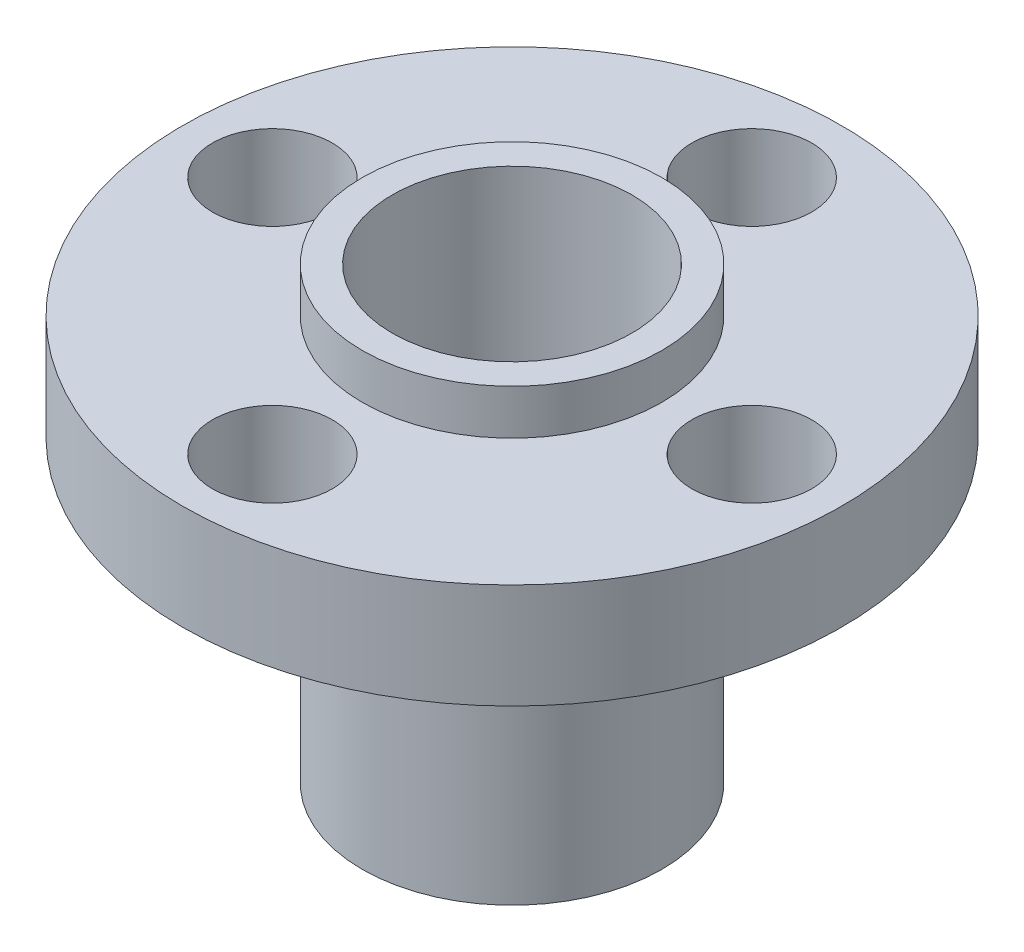
ISO-10303-21;
HEADER;
FILE_DESCRIPTION(('STEP AP214'),'2;1');
FILE_NAME('part.step','',(''),(''),'','','');
FILE_SCHEMA(('AUTOMOTIVE_DESIGN { 1 0 10303 214 1 1 1 1 }'));
ENDSEC;
DATA;
#1=APPLICATION_CONTEXT('core data for automotive mechanical design processes');
#2=APPLICATION_PROTOCOL_DEFINITION('international standard','automotive_design',2000,#1);
#3=PRODUCT_CONTEXT('',#1,'mechanical');
#4=PRODUCT('Part','Part','',(#3));
#5=PRODUCT_RELATED_PRODUCT_CATEGORY('part','',(#4));
#6=PRODUCT_DEFINITION_FORMATION('','',#4);
#7=PRODUCT_DEFINITION_CONTEXT('part definition',#1,'design');
#8=PRODUCT_DEFINITION('design','',#6,#7);
#9=PRODUCT_DEFINITION_SHAPE('','',#8);
#10=(LENGTH_UNIT() NAMED_UNIT(*) SI_UNIT(.MILLI.,.METRE.));
#11=(NAMED_UNIT(*) PLANE_ANGLE_UNIT() SI_UNIT($,.RADIAN.));
#12=(NAMED_UNIT(*) SI_UNIT($,.STERADIAN.) SOLID_ANGLE_UNIT());
#13=UNCERTAINTY_MEASURE_WITH_UNIT(LENGTH_MEASURE(1.E-05),#10,'distance_accuracy_value','');
#14=(GEOMETRIC_REPRESENTATION_CONTEXT(3) GLOBAL_UNCERTAINTY_ASSIGNED_CONTEXT((#13)) GLOBAL_UNIT_ASSIGNED_CONTEXT((#10,
#11,#12)) REPRESENTATION_CONTEXT('',''));
#15=CARTESIAN_POINT('',(0.,0.,0.));
#16=DIRECTION('',(0.,0.,1.));
#17=DIRECTION('',(1.,0.,0.));
#18=AXIS2_PLACEMENT_3D('',#15,#16,#17);
#19=CARTESIAN_POINT('',(0.,3.5,-8.));
#20=DIRECTION('',(0.,-1.,0.));
#21=DIRECTION('',(0.,0.,-1.));
#22=AXIS2_PLACEMENT_3D('',#19,#20,#21);
#23=CYLINDRICAL_SURFACE('',#22,2.);
#24=CARTESIAN_POINT('',(0.,3.5,-8.));
#25=DIRECTION('',(0.,1.,0.));
#26=DIRECTION('',(0.,0.,1.));
#27=AXIS2_PLACEMENT_3D('',#24,#25,#26);
#28=CIRCLE('',#27,2.);
#29=CARTESIAN_POINT('',(0.,3.5,-6.));
#30=VERTEX_POINT('',#29);
#31=EDGE_CURVE('E45',#30,#30,#28,.T.);
#32=ORIENTED_EDGE('',*,*,#31,.T.);
#33=EDGE_LOOP('',(#32));
#34=FACE_BOUND('',#33,.T.);
#35=CARTESIAN_POINT('',(0.,0.,-8.));
#36=DIRECTION('',(0.,1.,0.));
#37=DIRECTION('',(0.,0.,1.));
#38=AXIS2_PLACEMENT_3D('',#35,#36,#37);
#39=CIRCLE('',#38,2.);
#40=CARTESIAN_POINT('',(0.,0.,-6.));
#41=VERTEX_POINT('',#40);
#42=EDGE_CURVE('E58',#41,#41,#39,.T.);
#43=ORIENTED_EDGE('',*,*,#42,.F.);
#44=EDGE_LOOP('',(#43));
#45=FACE_BOUND('',#44,.T.);
#46=ADVANCED_FACE('F32',(#34,#45),#23,.F.);
#47=CARTESIAN_POINT('',(8.,3.5,0.));
#48=DIRECTION('',(0.,-1.,0.));
#49=DIRECTION('',(0.,0.,-1.));
#50=AXIS2_PLACEMENT_3D('',#47,#48,#49);
#51=CYLINDRICAL_SURFACE('',#50,2.);
#52=CARTESIAN_POINT('',(8.,3.5,0.));
#53=DIRECTION('',(0.,1.,0.));
#54=DIRECTION('',(0.,0.,1.));
#55=AXIS2_PLACEMENT_3D('',#52,#53,#54);
#56=CIRCLE('',#55,2.);
#57=CARTESIAN_POINT('',(8.,3.5,2.));
#58=VERTEX_POINT('',#57);
#59=EDGE_CURVE('E72',#58,#58,#56,.T.);
#60=ORIENTED_EDGE('',*,*,#59,.T.);
#61=EDGE_LOOP('',(#60));
#62=FACE_BOUND('',#61,.T.);
#63=CARTESIAN_POINT('',(8.,0.,0.));
#64=DIRECTION('',(0.,1.,0.));
#65=DIRECTION('',(0.,0.,1.));
#66=AXIS2_PLACEMENT_3D('',#63,#64,#65);
#67=CIRCLE('',#66,2.);
#68=CARTESIAN_POINT('',(8.,0.,2.));
#69=VERTEX_POINT('',#68);
#70=EDGE_CURVE('E56',#69,#69,#67,.T.);
#71=ORIENTED_EDGE('',*,*,#70,.F.);
#72=EDGE_LOOP('',(#71));
#73=FACE_BOUND('',#72,.T.);
#74=ADVANCED_FACE('F127',(#62,#73),#51,.F.);
#75=CARTESIAN_POINT('',(0.,3.5,8.));
#76=DIRECTION('',(0.,-1.,0.));
#77=DIRECTION('',(0.,0.,-1.));
#78=AXIS2_PLACEMENT_3D('',#75,#76,#77);
#79=CYLINDRICAL_SURFACE('',#78,2.);
#80=CARTESIAN_POINT('',(0.,3.5,8.));
#81=DIRECTION('',(0.,1.,0.));
#82=DIRECTION('',(0.,0.,1.));
#83=AXIS2_PLACEMENT_3D('',#80,#81,#82);
#84=CIRCLE('',#83,2.);
#85=CARTESIAN_POINT('',(0.,3.5,10.));
#86=VERTEX_POINT('',#85);
#87=EDGE_CURVE('E67',#86,#86,#84,.T.);
#88=ORIENTED_EDGE('',*,*,#87,.T.);
#89=EDGE_LOOP('',(#88));
#90=FACE_BOUND('',#89,.T.);
#91=CARTESIAN_POINT('',(0.,0.,8.));
#92=DIRECTION('',(0.,1.,0.));
#93=DIRECTION('',(0.,0.,1.));
#94=AXIS2_PLACEMENT_3D('',#91,#92,#93);
#95=CIRCLE('',#94,2.);
#96=CARTESIAN_POINT('',(0.,0.,10.));
#97=VERTEX_POINT('',#96);
#98=EDGE_CURVE('E52',#97,#97,#95,.T.);
#99=ORIENTED_EDGE('',*,*,#98,.F.);
#100=EDGE_LOOP('',(#99));
#101=FACE_BOUND('',#100,.T.);
#102=ADVANCED_FACE('F132',(#90,#101),#79,.F.);
#103=CARTESIAN_POINT('',(-8.,3.5,0.));
#104=DIRECTION('',(0.,-1.,0.));
#105=DIRECTION('',(0.,0.,-1.));
#106=AXIS2_PLACEMENT_3D('',#103,#104,#105);
#107=CYLINDRICAL_SURFACE('',#106,2.);
#108=CARTESIAN_POINT('',(-8.,3.5,0.));
#109=DIRECTION('',(0.,1.,0.));
#110=DIRECTION('',(0.,0.,1.));
#111=AXIS2_PLACEMENT_3D('',#108,#109,#110);
#112=CIRCLE('',#111,2.);
#113=CARTESIAN_POINT('',(-8.,3.5,2.));
#114=VERTEX_POINT('',#113);
#115=EDGE_CURVE('E63',#114,#114,#112,.T.);
#116=ORIENTED_EDGE('',*,*,#115,.T.);
#117=EDGE_LOOP('',(#116));
#118=FACE_BOUND('',#117,.T.);
#119=CARTESIAN_POINT('',(-8.,0.,0.));
#120=DIRECTION('',(0.,1.,0.));
#121=DIRECTION('',(0.,0.,1.));
#122=AXIS2_PLACEMENT_3D('',#119,#120,#121);
#123=CIRCLE('',#122,2.);
#124=CARTESIAN_POINT('',(-8.,0.,2.));
#125=VERTEX_POINT('',#124);
#126=EDGE_CURVE('E49',#125,#125,#123,.T.);
#127=ORIENTED_EDGE('',*,*,#126,.F.);
#128=EDGE_LOOP('',(#127));
#129=FACE_BOUND('',#128,.T.);
#130=ADVANCED_FACE('F34',(#118,#129),#107,.F.);
#131=CARTESIAN_POINT('',(0.,3.5,0.));
#132=DIRECTION('',(0.,-1.,0.));
#133=DIRECTION('',(0.,0.,-1.));
#134=AXIS2_PLACEMENT_3D('',#131,#132,#133);
#135=CYLINDRICAL_SURFACE('',#134,11.);
#136=CARTESIAN_POINT('',(0.,3.5,0.));
#137=DIRECTION('',(0.,1.,0.));
#138=DIRECTION('',(0.,0.,1.));
#139=AXIS2_PLACEMENT_3D('',#136,#137,#138);
#140=CIRCLE('',#139,11.);
#141=CARTESIAN_POINT('',(0.,3.5,11.));
#142=VERTEX_POINT('',#141);
#143=EDGE_CURVE('E10',#142,#142,#140,.T.);
#144=ORIENTED_EDGE('',*,*,#143,.F.);
#145=EDGE_LOOP('',(#144));
#146=FACE_BOUND('',#145,.T.);
#147=CARTESIAN_POINT('',(0.,0.,0.));
#148=DIRECTION('',(0.,1.,0.));
#149=DIRECTION('',(0.,0.,1.));
#150=AXIS2_PLACEMENT_3D('',#147,#148,#149);
#151=CIRCLE('',#150,11.);
#152=CARTESIAN_POINT('',(0.,0.,11.));
#153=VERTEX_POINT('',#152);
#154=EDGE_CURVE('E36',#153,#153,#151,.T.);
#155=ORIENTED_EDGE('',*,*,#154,.T.);
#156=EDGE_LOOP('',(#155));
#157=FACE_BOUND('',#156,.T.);
#158=ADVANCED_FACE('F87',(#146,#157),#135,.T.);
#159=CARTESIAN_POINT('',(0.,3.5,0.));
#160=DIRECTION('',(0.,1.,0.));
#161=DIRECTION('',(0.,0.,1.));
#162=AXIS2_PLACEMENT_3D('',#159,#160,#161);
#163=PLANE('',#162);
#164=ORIENTED_EDGE('',*,*,#115,.F.);
#165=EDGE_LOOP('',(#164));
#166=FACE_BOUND('',#165,.T.);
#167=ORIENTED_EDGE('',*,*,#87,.F.);
#168=EDGE_LOOP('',(#167));
#169=FACE_BOUND('',#168,.T.);
#170=ORIENTED_EDGE('',*,*,#59,.F.);
#171=EDGE_LOOP('',(#170));
#172=FACE_BOUND('',#171,.T.);
#173=ORIENTED_EDGE('',*,*,#31,.F.);
#174=EDGE_LOOP('',(#173));
#175=FACE_BOUND('',#174,.T.);
#176=CARTESIAN_POINT('',(0.,3.5,0.));
#177=DIRECTION('',(0.,1.,0.));
#178=DIRECTION('',(0.,0.,1.));
#179=AXIS2_PLACEMENT_3D('',#176,#177,#178);
#180=CIRCLE('',#179,5.);
#181=CARTESIAN_POINT('',(0.,3.5,5.));
#182=VERTEX_POINT('',#181);
#183=EDGE_CURVE('E40',#182,#182,#180,.T.);
#184=ORIENTED_EDGE('',*,*,#183,.F.);
#185=EDGE_LOOP('',(#184));
#186=FACE_BOUND('',#185,.T.);
#187=ORIENTED_EDGE('',*,*,#143,.T.);
#188=EDGE_LOOP('',(#187));
#189=FACE_BOUND('',#188,.T.);
#190=ADVANCED_FACE('F83',(#166,#169,#172,#175,#186,#189),#163,.T.);
#191=CARTESIAN_POINT('',(0.,0.,0.));
#192=DIRECTION('',(0.,1.,0.));
#193=DIRECTION('',(0.,0.,1.));
#194=AXIS2_PLACEMENT_3D('',#191,#192,#193);
#195=PLANE('',#194);
#196=CARTESIAN_POINT('',(0.,0.,0.));
#197=DIRECTION('',(0.,1.,0.));
#198=DIRECTION('',(0.,0.,1.));
#199=AXIS2_PLACEMENT_3D('',#196,#197,#198);
#200=CIRCLE('',#199,5.);
#201=CARTESIAN_POINT('',(0.,0.,5.));
#202=VERTEX_POINT('',#201);
#203=EDGE_CURVE('E110',#202,#202,#200,.T.);
#204=ORIENTED_EDGE('',*,*,#203,.T.);
#205=EDGE_LOOP('',(#204));
#206=FACE_BOUND('',#205,.T.);
#207=ORIENTED_EDGE('',*,*,#126,.T.);
#208=EDGE_LOOP('',(#207));
#209=FACE_BOUND('',#208,.T.);
#210=ORIENTED_EDGE('',*,*,#98,.T.);
#211=EDGE_LOOP('',(#210));
#212=FACE_BOUND('',#211,.T.);
#213=ORIENTED_EDGE('',*,*,#70,.T.);
#214=EDGE_LOOP('',(#213));
#215=FACE_BOUND('',#214,.T.);
#216=ORIENTED_EDGE('',*,*,#42,.T.);
#217=EDGE_LOOP('',(#216));
#218=FACE_BOUND('',#217,.T.);
#219=ORIENTED_EDGE('',*,*,#154,.F.);
#220=EDGE_LOOP('',(#219));
#221=FACE_BOUND('',#220,.T.);
#222=ADVANCED_FACE('F86',(#206,#209,#212,#215,#218,#221),#195,.F.);
#223=CARTESIAN_POINT('',(0.,5.,0.));
#224=DIRECTION('',(0.,-1.,0.));
#225=DIRECTION('',(0.,0.,-1.));
#226=AXIS2_PLACEMENT_3D('',#223,#224,#225);
#227=CYLINDRICAL_SURFACE('',#226,4.);
#228=CARTESIAN_POINT('',(0.,5.,0.));
#229=DIRECTION('',(0.,1.,0.));
#230=DIRECTION('',(0.,0.,1.));
#231=AXIS2_PLACEMENT_3D('',#228,#229,#230);
#232=CIRCLE('',#231,4.);
#233=CARTESIAN_POINT('',(0.,5.,4.));
#234=VERTEX_POINT('',#233);
#235=EDGE_CURVE('E101',#234,#234,#232,.T.);
#236=ORIENTED_EDGE('',*,*,#235,.T.);
#237=EDGE_LOOP('',(#236));
#238=FACE_BOUND('',#237,.T.);
#239=CARTESIAN_POINT('',(0.,-10.,0.));
#240=DIRECTION('',(0.,1.,0.));
#241=DIRECTION('',(0.,0.,1.));
#242=AXIS2_PLACEMENT_3D('',#239,#240,#241);
#243=CIRCLE('',#242,4.);
#244=CARTESIAN_POINT('',(0.,-10.,4.));
#245=VERTEX_POINT('',#244);
#246=EDGE_CURVE('E107',#245,#245,#243,.T.);
#247=ORIENTED_EDGE('',*,*,#246,.F.);
#248=EDGE_LOOP('',(#247));
#249=FACE_BOUND('',#248,.T.);
#250=ADVANCED_FACE('F96',(#238,#249),#227,.F.);
#251=CARTESIAN_POINT('',(0.,5.,0.));
#252=DIRECTION('',(0.,-1.,0.));
#253=DIRECTION('',(0.,0.,-1.));
#254=AXIS2_PLACEMENT_3D('',#251,#252,#253);
#255=CYLINDRICAL_SURFACE('',#254,5.);
#256=ORIENTED_EDGE('',*,*,#183,.T.);
#257=EDGE_LOOP('',(#256));
#258=FACE_BOUND('',#257,.T.);
#259=CARTESIAN_POINT('',(0.,5.,0.));
#260=DIRECTION('',(0.,1.,0.));
#261=DIRECTION('',(0.,0.,1.));
#262=AXIS2_PLACEMENT_3D('',#259,#260,#261);
#263=CIRCLE('',#262,5.);
#264=CARTESIAN_POINT('',(0.,5.,5.));
#265=VERTEX_POINT('',#264);
#266=EDGE_CURVE('E53',#265,#265,#263,.T.);
#267=ORIENTED_EDGE('',*,*,#266,.F.);
#268=EDGE_LOOP('',(#267));
#269=FACE_BOUND('',#268,.T.);
#270=ADVANCED_FACE('F92',(#258,#269),#255,.T.);
#271=CARTESIAN_POINT('',(0.,5.,0.));
#272=DIRECTION('',(0.,1.,0.));
#273=DIRECTION('',(0.,0.,1.));
#274=AXIS2_PLACEMENT_3D('',#271,#272,#273);
#275=PLANE('',#274);
#276=ORIENTED_EDGE('',*,*,#235,.F.);
#277=EDGE_LOOP('',(#276));
#278=FACE_BOUND('',#277,.T.);
#279=ORIENTED_EDGE('',*,*,#266,.T.);
#280=EDGE_LOOP('',(#279));
#281=FACE_BOUND('',#280,.T.);
#282=ADVANCED_FACE('F95',(#278,#281),#275,.T.);
#283=CARTESIAN_POINT('',(0.,-10.,0.));
#284=DIRECTION('',(0.,1.,0.));
#285=DIRECTION('',(0.,0.,1.));
#286=AXIS2_PLACEMENT_3D('',#283,#284,#285);
#287=CYLINDRICAL_SURFACE('',#286,5.);
#288=CARTESIAN_POINT('',(0.,-10.,0.));
#289=DIRECTION('',(0.,1.,0.));
#290=DIRECTION('',(0.,0.,1.));
#291=AXIS2_PLACEMENT_3D('',#288,#289,#290);
#292=CIRCLE('',#291,5.);
#293=CARTESIAN_POINT('',(0.,-10.,5.));
#294=VERTEX_POINT('',#293);
#295=EDGE_CURVE('E103',#294,#294,#292,.T.);
#296=ORIENTED_EDGE('',*,*,#295,.T.);
#297=EDGE_LOOP('',(#296));
#298=FACE_BOUND('',#297,.T.);
#299=ORIENTED_EDGE('',*,*,#203,.F.);
#300=EDGE_LOOP('',(#299));
#301=FACE_BOUND('',#300,.T.);
#302=ADVANCED_FACE('F186',(#298,#301),#287,.T.);
#303=CARTESIAN_POINT('',(0.,-10.,0.));
#304=DIRECTION('',(0.,1.,0.));
#305=DIRECTION('',(0.,0.,1.));
#306=AXIS2_PLACEMENT_3D('',#303,#304,#305);
#307=PLANE('',#306);
#308=ORIENTED_EDGE('',*,*,#246,.T.);
#309=EDGE_LOOP('',(#308));
#310=FACE_BOUND('',#309,.T.);
#311=ORIENTED_EDGE('',*,*,#295,.F.);
#312=EDGE_LOOP('',(#311));
#313=FACE_BOUND('',#312,.T.);
#314=ADVANCED_FACE('F116',(#310,#313),#307,.F.);
#315=CLOSED_SHELL('',(#46,#74,#102,#130,#158,#190,#222,#250,#270,#282,#302,#314));
#316=MANIFOLD_SOLID_BREP('B2',#315);
#317=ADVANCED_BREP_SHAPE_REPRESENTATION('',(#18,#316),#14);
#318=SHAPE_DEFINITION_REPRESENTATION(#9,#317);
ENDSEC;
END-ISO-10303-21;
